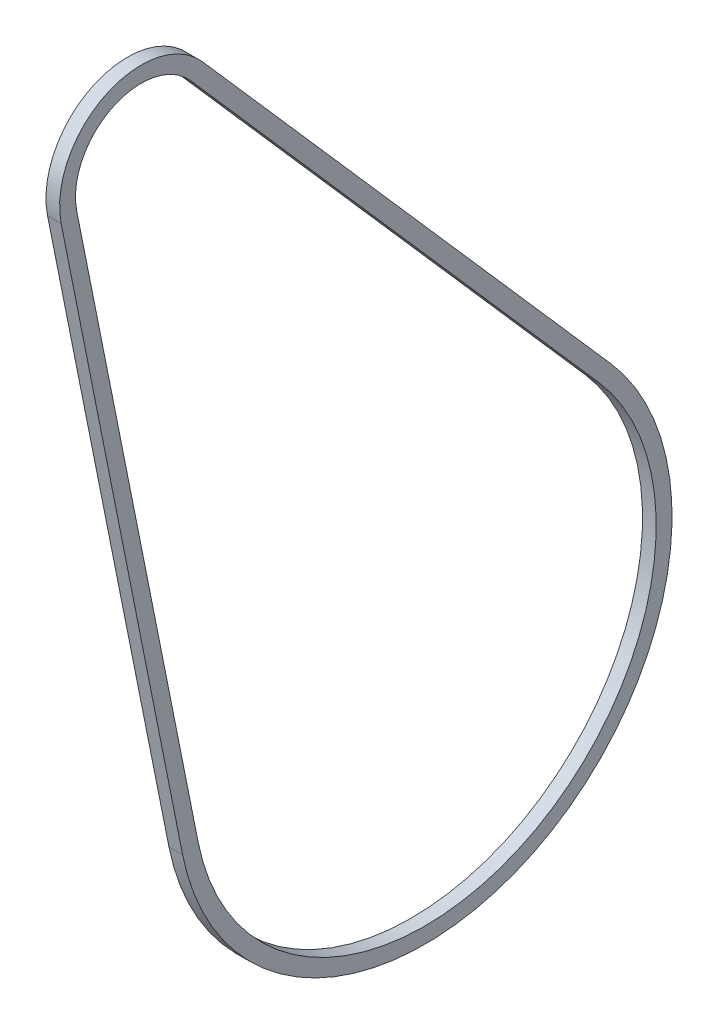
ISO-10303-21;
HEADER;
FILE_DESCRIPTION(('STEP AP214'),'2;1');
FILE_NAME('part.step','',(''),(''),'','','');
FILE_SCHEMA(('AUTOMOTIVE_DESIGN { 1 0 10303 214 1 1 1 1 }'));
ENDSEC;
DATA;
#1=APPLICATION_CONTEXT('core data for automotive mechanical design processes');
#2=APPLICATION_PROTOCOL_DEFINITION('international standard','automotive_design',2000,#1);
#3=PRODUCT_CONTEXT('',#1,'mechanical');
#4=PRODUCT('Part','Part','',(#3));
#5=PRODUCT_RELATED_PRODUCT_CATEGORY('part','',(#4));
#6=PRODUCT_DEFINITION_FORMATION('','',#4);
#7=PRODUCT_DEFINITION_CONTEXT('part definition',#1,'design');
#8=PRODUCT_DEFINITION('design','',#6,#7);
#9=PRODUCT_DEFINITION_SHAPE('','',#8);
#10=(LENGTH_UNIT() NAMED_UNIT(*) SI_UNIT(.MILLI.,.METRE.));
#11=(NAMED_UNIT(*) PLANE_ANGLE_UNIT() SI_UNIT($,.RADIAN.));
#12=(NAMED_UNIT(*) SI_UNIT($,.STERADIAN.) SOLID_ANGLE_UNIT());
#13=UNCERTAINTY_MEASURE_WITH_UNIT(LENGTH_MEASURE(1.E-05),#10,'distance_accuracy_value','');
#14=(GEOMETRIC_REPRESENTATION_CONTEXT(3) GLOBAL_UNCERTAINTY_ASSIGNED_CONTEXT((#13)) GLOBAL_UNIT_ASSIGNED_CONTEXT((#10,
#11,#12)) REPRESENTATION_CONTEXT('',''));
#15=CARTESIAN_POINT('',(0.,0.,0.));
#16=DIRECTION('',(0.,0.,1.));
#17=DIRECTION('',(1.,0.,0.));
#18=AXIS2_PLACEMENT_3D('',#15,#16,#17);
#19=CARTESIAN_POINT('',(114.318200000135,469.,-817.328968128199));
#20=DIRECTION('',(1.,0.,0.));
#21=DIRECTION('',(0.,1.,0.));
#22=AXIS2_PLACEMENT_3D('',#19,#20,#21);
#23=CYLINDRICAL_SURFACE('',#22,38.77);
#24=CARTESIAN_POINT('',(120.818200000135,469.,-817.328968128199));
#25=DIRECTION('',(1.,0.,0.));
#26=DIRECTION('',(0.,-1.,0.));
#27=AXIS2_PLACEMENT_3D('',#24,#25,#26);
#28=CIRCLE('',#27,38.77);
#29=CARTESIAN_POINT('',(120.818200000135,494.561851816879,-846.478661637598));
#30=VERTEX_POINT('',#29);
#31=CARTESIAN_POINT('',(120.818200000135,461.398343216573,-779.311502219134));
#32=VERTEX_POINT('',#31);
#33=EDGE_CURVE('E137',#30,#32,#28,.T.);
#34=ORIENTED_EDGE('',*,*,#33,.F.);
#35=DIRECTION('',(1.,0.,0.));
#36=VECTOR('',#35,1.);
#37=CARTESIAN_POINT('',(114.318200000135,494.561851816879,-846.478661637598));
#38=LINE('',#37,#36);
#39=CARTESIAN_POINT('',(114.318200000135,494.561851816879,-846.478661637598));
#40=VERTEX_POINT('',#39);
#41=EDGE_CURVE('E11',#40,#30,#38,.T.);
#42=ORIENTED_EDGE('',*,*,#41,.F.);
#43=CARTESIAN_POINT('',(114.318200000135,469.,-817.328968128199));
#44=DIRECTION('',(1.,0.,0.));
#45=DIRECTION('',(0.,-1.,0.));
#46=AXIS2_PLACEMENT_3D('',#43,#44,#45);
#47=CIRCLE('',#46,38.77);
#48=CARTESIAN_POINT('',(114.318200000135,461.398343216573,-779.311502219134));
#49=VERTEX_POINT('',#48);
#50=EDGE_CURVE('E141',#40,#49,#47,.T.);
#51=ORIENTED_EDGE('',*,*,#50,.T.);
#52=DIRECTION('',(1.,0.,0.));
#53=VECTOR('',#52,1.);
#54=CARTESIAN_POINT('',(114.318200000135,461.398343216573,-779.311502219134));
#55=LINE('',#54,#53);
#56=EDGE_CURVE('E42',#49,#32,#55,.T.);
#57=ORIENTED_EDGE('',*,*,#56,.T.);
#58=EDGE_LOOP('',(#34,#42,#51,#57));
#59=FACE_BOUND('',#58,.T.);
#60=ADVANCED_FACE('F39',(#59),#23,.T.);
#61=CARTESIAN_POINT('',(114.318200000135,494.561851816879,-846.478661637598));
#62=DIRECTION('',(0.,0.659320397649722,-0.751862097224626));
#63=DIRECTION('',(0.,0.751862097224626,0.659320397649722));
#64=AXIS2_PLACEMENT_3D('',#61,#62,#63);
#65=PLANE('',#64);
#66=DIRECTION('',(0.,0.751862097224626,0.659320397649722));
#67=VECTOR('',#66,1.);
#68=CARTESIAN_POINT('',(120.818200000135,494.561851816879,-846.478661637598));
#69=LINE('',#68,#67);
#70=CARTESIAN_POINT('',(120.818200000135,273.076519539842,-1040.70283903598));
#71=VERTEX_POINT('',#70);
#72=EDGE_CURVE('E145',#71,#30,#69,.T.);
#73=ORIENTED_EDGE('',*,*,#72,.F.);
#74=DIRECTION('',(1.,0.,0.));
#75=VECTOR('',#74,1.);
#76=CARTESIAN_POINT('',(114.318200000135,273.076519539842,-1040.70283903598));
#77=LINE('',#76,#75);
#78=CARTESIAN_POINT('',(114.318200000135,273.076519539842,-1040.70283903598));
#79=VERTEX_POINT('',#78);
#80=EDGE_CURVE('E47',#79,#71,#77,.T.);
#81=ORIENTED_EDGE('',*,*,#80,.F.);
#82=DIRECTION('',(0.,0.751862097224626,0.659320397649722));
#83=VECTOR('',#82,1.);
#84=CARTESIAN_POINT('',(114.318200000135,494.561851816879,-846.478661637598));
#85=LINE('',#84,#83);
#86=EDGE_CURVE('E151',#79,#40,#85,.T.);
#87=ORIENTED_EDGE('',*,*,#86,.T.);
#88=ORIENTED_EDGE('',*,*,#41,.T.);
#89=EDGE_LOOP('',(#73,#81,#87,#88));
#90=FACE_BOUND('',#89,.T.);
#91=ADVANCED_FACE('F177',(#90),#65,.T.);
#92=CARTESIAN_POINT('',(114.318200000135,195.580000000094,-952.3289681282));
#93=DIRECTION('',(1.,0.,0.));
#94=DIRECTION('',(0.,1.,0.));
#95=AXIS2_PLACEMENT_3D('',#92,#93,#94);
#96=CYLINDRICAL_SURFACE('',#95,117.54);
#97=CARTESIAN_POINT('',(120.818200000135,195.580000000094,-952.3289681282));
#98=DIRECTION('',(1.,0.,0.));
#99=DIRECTION('',(0.,-1.,0.));
#100=AXIS2_PLACEMENT_3D('',#97,#98,#99);
#101=CIRCLE('',#100,117.54);
#102=CARTESIAN_POINT('',(120.818200000135,172.533862823823,-837.07044496721));
#103=VERTEX_POINT('',#102);
#104=EDGE_CURVE('E159',#103,#71,#101,.T.);
#105=ORIENTED_EDGE('',*,*,#104,.F.);
#106=DIRECTION('',(1.,0.,0.));
#107=VECTOR('',#106,1.);
#108=CARTESIAN_POINT('',(114.318200000135,172.533862823823,-837.07044496721));
#109=LINE('',#108,#107);
#110=CARTESIAN_POINT('',(114.318200000135,172.533862823823,-837.07044496721));
#111=VERTEX_POINT('',#110);
#112=EDGE_CURVE('E164',#111,#103,#109,.T.);
#113=ORIENTED_EDGE('',*,*,#112,.F.);
#114=CARTESIAN_POINT('',(114.318200000135,195.580000000094,-952.3289681282));
#115=DIRECTION('',(1.,0.,0.));
#116=DIRECTION('',(0.,-1.,0.));
#117=AXIS2_PLACEMENT_3D('',#114,#115,#116);
#118=CIRCLE('',#117,117.54);
#119=EDGE_CURVE('E148',#111,#79,#118,.T.);
#120=ORIENTED_EDGE('',*,*,#119,.T.);
#121=ORIENTED_EDGE('',*,*,#80,.T.);
#122=EDGE_LOOP('',(#105,#113,#120,#121));
#123=FACE_BOUND('',#122,.T.);
#124=ADVANCED_FACE('F181',(#123),#96,.T.);
#125=CARTESIAN_POINT('',(114.318200000135,461.398343216573,-779.311502219134));
#126=DIRECTION('',(0.,-0.196070590235414,0.980589783571467));
#127=DIRECTION('',(0.,-0.980589783571467,-0.196070590235414));
#128=AXIS2_PLACEMENT_3D('',#125,#126,#127);
#129=PLANE('',#128);
#130=DIRECTION('',(0.,-0.980589783571467,-0.196070590235414));
#131=VECTOR('',#130,1.);
#132=CARTESIAN_POINT('',(120.818200000135,461.398343216573,-779.311502219134));
#133=LINE('',#132,#131);
#134=EDGE_CURVE('E156',#32,#103,#133,.T.);
#135=ORIENTED_EDGE('',*,*,#134,.F.);
#136=ORIENTED_EDGE('',*,*,#56,.F.);
#137=DIRECTION('',(0.,-0.980589783571467,-0.196070590235414));
#138=VECTOR('',#137,1.);
#139=CARTESIAN_POINT('',(114.318200000135,461.398343216573,-779.311502219134));
#140=LINE('',#139,#138);
#141=EDGE_CURVE('E144',#49,#111,#140,.T.);
#142=ORIENTED_EDGE('',*,*,#141,.T.);
#143=ORIENTED_EDGE('',*,*,#112,.T.);
#144=EDGE_LOOP('',(#135,#136,#142,#143));
#145=FACE_BOUND('',#144,.T.);
#146=ADVANCED_FACE('F172',(#145),#129,.T.);
#147=CARTESIAN_POINT('',(114.318200000135,469.,-817.328968128199));
#148=DIRECTION('',(-1.,0.,0.));
#149=DIRECTION('',(0.,-1.,0.));
#150=AXIS2_PLACEMENT_3D('',#147,#148,#149);
#151=PLANE('',#150);
#152=CARTESIAN_POINT('',(114.318200000135,469.,-817.3289681282));
#153=DIRECTION('',(1.,0.,0.));
#154=DIRECTION('',(0.,-1.,0.));
#155=AXIS2_PLACEMENT_3D('',#152,#153,#154);
#156=CIRCLE('',#155,31.23);
#157=CARTESIAN_POINT('',(114.318200000135,489.5905760186,-840.809621424524));
#158=VERTEX_POINT('',#157);
#159=CARTESIAN_POINT('',(114.318200000135,462.876715466948,-786.705149187263));
#160=VERTEX_POINT('',#159);
#161=EDGE_CURVE('E106',#158,#160,#156,.T.);
#162=ORIENTED_EDGE('',*,*,#161,.T.);
#163=DIRECTION('',(0.,-0.980589783571467,-0.196070590235414));
#164=VECTOR('',#163,1.);
#165=CARTESIAN_POINT('',(114.318200000135,462.876715466948,-786.705149187263));
#166=LINE('',#165,#164);
#167=CARTESIAN_POINT('',(114.318200000135,174.012235074198,-844.464091935339));
#168=VERTEX_POINT('',#167);
#169=EDGE_CURVE('E115',#160,#168,#166,.T.);
#170=ORIENTED_EDGE('',*,*,#169,.T.);
#171=CARTESIAN_POINT('',(114.318200000135,195.580000000091,-952.3289681282));
#172=DIRECTION('',(1.,0.,0.));
#173=DIRECTION('',(0.,-1.,0.));
#174=AXIS2_PLACEMENT_3D('',#171,#172,#173);
#175=CIRCLE('',#174,110.000000000001);
#176=CARTESIAN_POINT('',(114.318200000135,268.105243741563,-1035.03379882291));
#177=VERTEX_POINT('',#176);
#178=EDGE_CURVE('E55',#168,#177,#175,.T.);
#179=ORIENTED_EDGE('',*,*,#178,.T.);
#180=DIRECTION('',(0.,0.751862097224626,0.659320397649721));
#181=VECTOR('',#180,1.);
#182=CARTESIAN_POINT('',(114.318200000135,489.5905760186,-840.809621424524));
#183=LINE('',#182,#181);
#184=EDGE_CURVE('E112',#177,#158,#183,.T.);
#185=ORIENTED_EDGE('',*,*,#184,.T.);
#186=EDGE_LOOP('',(#162,#170,#179,#185));
#187=FACE_BOUND('',#186,.T.);
#188=ORIENTED_EDGE('',*,*,#50,.F.);
#189=ORIENTED_EDGE('',*,*,#86,.F.);
#190=ORIENTED_EDGE('',*,*,#119,.F.);
#191=ORIENTED_EDGE('',*,*,#141,.F.);
#192=EDGE_LOOP('',(#188,#189,#190,#191));
#193=FACE_BOUND('',#192,.T.);
#194=ADVANCED_FACE('F119',(#187,#193),#151,.T.);
#195=CARTESIAN_POINT('',(120.818200000135,469.,-817.328968128199));
#196=DIRECTION('',(-1.,0.,0.));
#197=DIRECTION('',(0.,-1.,0.));
#198=AXIS2_PLACEMENT_3D('',#195,#196,#197);
#199=PLANE('',#198);
#200=DIRECTION('',(0.,-0.980589783571467,-0.196070590235414));
#201=VECTOR('',#200,1.);
#202=CARTESIAN_POINT('',(120.818200000135,462.876715466948,-786.705149187263));
#203=LINE('',#202,#201);
#204=CARTESIAN_POINT('',(120.818200000135,462.876715466948,-786.705149187263));
#205=VERTEX_POINT('',#204);
#206=CARTESIAN_POINT('',(120.818200000135,174.012235074198,-844.464091935337));
#207=VERTEX_POINT('',#206);
#208=EDGE_CURVE('E131',#205,#207,#203,.T.);
#209=ORIENTED_EDGE('',*,*,#208,.F.);
#210=CARTESIAN_POINT('',(120.818200000135,469.,-817.3289681282));
#211=DIRECTION('',(1.,0.,0.));
#212=DIRECTION('',(0.,-1.,0.));
#213=AXIS2_PLACEMENT_3D('',#210,#211,#212);
#214=CIRCLE('',#213,31.23);
#215=CARTESIAN_POINT('',(120.818200000135,489.5905760186,-840.809621424524));
#216=VERTEX_POINT('',#215);
#217=EDGE_CURVE('E63',#216,#205,#214,.T.);
#218=ORIENTED_EDGE('',*,*,#217,.F.);
#219=DIRECTION('',(0.,0.751862097224626,0.659320397649721));
#220=VECTOR('',#219,1.);
#221=CARTESIAN_POINT('',(120.818200000135,489.5905760186,-840.809621424524));
#222=LINE('',#221,#220);
#223=CARTESIAN_POINT('',(120.818200000135,268.105243741563,-1035.03379882291));
#224=VERTEX_POINT('',#223);
#225=EDGE_CURVE('E122',#224,#216,#222,.T.);
#226=ORIENTED_EDGE('',*,*,#225,.F.);
#227=CARTESIAN_POINT('',(120.818200000135,195.580000000091,-952.3289681282));
#228=DIRECTION('',(1.,0.,0.));
#229=DIRECTION('',(0.,-1.,0.));
#230=AXIS2_PLACEMENT_3D('',#227,#228,#229);
#231=CIRCLE('',#230,110.000000000001);
#232=EDGE_CURVE('E125',#207,#224,#231,.T.);
#233=ORIENTED_EDGE('',*,*,#232,.F.);
#234=EDGE_LOOP('',(#209,#218,#226,#233));
#235=FACE_BOUND('',#234,.T.);
#236=ORIENTED_EDGE('',*,*,#33,.T.);
#237=ORIENTED_EDGE('',*,*,#134,.T.);
#238=ORIENTED_EDGE('',*,*,#104,.T.);
#239=ORIENTED_EDGE('',*,*,#72,.T.);
#240=EDGE_LOOP('',(#236,#237,#238,#239));
#241=FACE_BOUND('',#240,.T.);
#242=ADVANCED_FACE('F174',(#235,#241),#199,.F.);
#243=CARTESIAN_POINT('',(114.318200000135,469.,-817.3289681282));
#244=DIRECTION('',(1.,0.,0.));
#245=DIRECTION('',(0.,1.,0.));
#246=AXIS2_PLACEMENT_3D('',#243,#244,#245);
#247=CYLINDRICAL_SURFACE('',#246,31.23);
#248=ORIENTED_EDGE('',*,*,#217,.T.);
#249=DIRECTION('',(1.,0.,0.));
#250=VECTOR('',#249,1.);
#251=CARTESIAN_POINT('',(114.318200000135,462.876715466948,-786.705149187263));
#252=LINE('',#251,#250);
#253=EDGE_CURVE('E102',#160,#205,#252,.T.);
#254=ORIENTED_EDGE('',*,*,#253,.F.);
#255=ORIENTED_EDGE('',*,*,#161,.F.);
#256=DIRECTION('',(1.,0.,0.));
#257=VECTOR('',#256,1.);
#258=CARTESIAN_POINT('',(114.318200000135,489.5905760186,-840.809621424524));
#259=LINE('',#258,#257);
#260=EDGE_CURVE('E135',#158,#216,#259,.T.);
#261=ORIENTED_EDGE('',*,*,#260,.T.);
#262=EDGE_LOOP('',(#248,#254,#255,#261));
#263=FACE_BOUND('',#262,.T.);
#264=ADVANCED_FACE('F104',(#263),#247,.F.);
#265=CARTESIAN_POINT('',(114.318200000135,489.5905760186,-840.809621424524));
#266=DIRECTION('',(0.,0.659320397649721,-0.751862097224626));
#267=DIRECTION('',(0.,0.751862097224626,0.659320397649721));
#268=AXIS2_PLACEMENT_3D('',#265,#266,#267);
#269=PLANE('',#268);
#270=ORIENTED_EDGE('',*,*,#225,.T.);
#271=ORIENTED_EDGE('',*,*,#260,.F.);
#272=ORIENTED_EDGE('',*,*,#184,.F.);
#273=DIRECTION('',(1.,0.,0.));
#274=VECTOR('',#273,1.);
#275=CARTESIAN_POINT('',(114.318200000135,268.105243741563,-1035.03379882291));
#276=LINE('',#275,#274);
#277=EDGE_CURVE('E138',#177,#224,#276,.T.);
#278=ORIENTED_EDGE('',*,*,#277,.T.);
#279=EDGE_LOOP('',(#270,#271,#272,#278));
#280=FACE_BOUND('',#279,.T.);
#281=ADVANCED_FACE('F237',(#280),#269,.F.);
#282=CARTESIAN_POINT('',(114.318200000135,195.580000000091,-952.3289681282));
#283=DIRECTION('',(1.,0.,0.));
#284=DIRECTION('',(0.,1.,0.));
#285=AXIS2_PLACEMENT_3D('',#282,#283,#284);
#286=CYLINDRICAL_SURFACE('',#285,110.000000000001);
#287=ORIENTED_EDGE('',*,*,#232,.T.);
#288=ORIENTED_EDGE('',*,*,#277,.F.);
#289=ORIENTED_EDGE('',*,*,#178,.F.);
#290=DIRECTION('',(1.,0.,0.));
#291=VECTOR('',#290,1.);
#292=CARTESIAN_POINT('',(114.318200000135,174.012235074198,-844.464091935337));
#293=LINE('',#292,#291);
#294=EDGE_CURVE('E111',#168,#207,#293,.T.);
#295=ORIENTED_EDGE('',*,*,#294,.T.);
#296=EDGE_LOOP('',(#287,#288,#289,#295));
#297=FACE_BOUND('',#296,.T.);
#298=ADVANCED_FACE('F247',(#297),#286,.F.);
#299=CARTESIAN_POINT('',(114.318200000135,462.876715466948,-786.705149187263));
#300=DIRECTION('',(0.,-0.196070590235414,0.980589783571467));
#301=DIRECTION('',(0.,-0.980589783571467,-0.196070590235414));
#302=AXIS2_PLACEMENT_3D('',#299,#300,#301);
#303=PLANE('',#302);
#304=ORIENTED_EDGE('',*,*,#208,.T.);
#305=ORIENTED_EDGE('',*,*,#294,.F.);
#306=ORIENTED_EDGE('',*,*,#169,.F.);
#307=ORIENTED_EDGE('',*,*,#253,.T.);
#308=EDGE_LOOP('',(#304,#305,#306,#307));
#309=FACE_BOUND('',#308,.T.);
#310=ADVANCED_FACE('F116',(#309),#303,.F.);
#311=CLOSED_SHELL('',(#60,#91,#124,#146,#194,#242,#264,#281,#298,#310));
#312=MANIFOLD_SOLID_BREP('B2',#311);
#313=ADVANCED_BREP_SHAPE_REPRESENTATION('',(#18,#312),#14);
#314=SHAPE_DEFINITION_REPRESENTATION(#9,#313);
ENDSEC;
END-ISO-10303-21;
